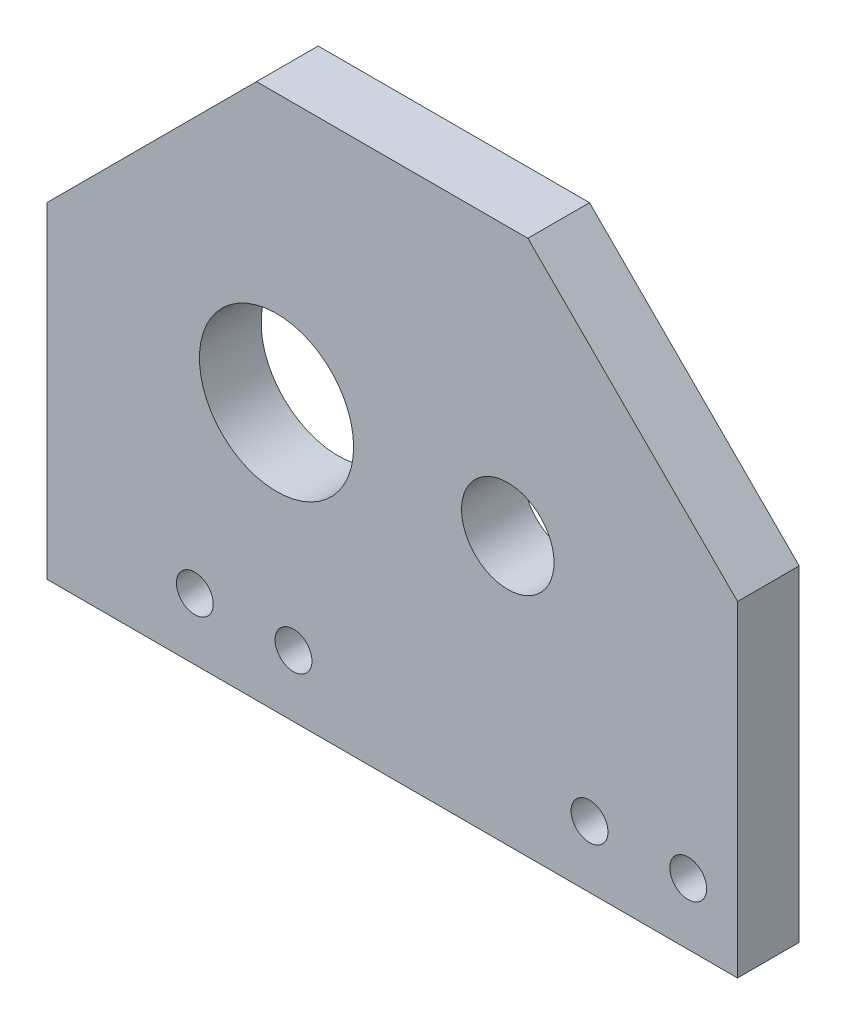
ISO-10303-21;
HEADER;
FILE_DESCRIPTION(('STEP AP214'),'2;1');
FILE_NAME('part.step','',(''),(''),'','','');
FILE_SCHEMA(('AUTOMOTIVE_DESIGN { 1 0 10303 214 1 1 1 1 }'));
ENDSEC;
DATA;
#1=APPLICATION_CONTEXT('core data for automotive mechanical design processes');
#2=APPLICATION_PROTOCOL_DEFINITION('international standard','automotive_design',2000,#1);
#3=PRODUCT_CONTEXT('',#1,'mechanical');
#4=PRODUCT('Part','Part','',(#3));
#5=PRODUCT_RELATED_PRODUCT_CATEGORY('part','',(#4));
#6=PRODUCT_DEFINITION_FORMATION('','',#4);
#7=PRODUCT_DEFINITION_CONTEXT('part definition',#1,'design');
#8=PRODUCT_DEFINITION('design','',#6,#7);
#9=PRODUCT_DEFINITION_SHAPE('','',#8);
#10=(LENGTH_UNIT() NAMED_UNIT(*) SI_UNIT(.MILLI.,.METRE.));
#11=(NAMED_UNIT(*) PLANE_ANGLE_UNIT() SI_UNIT($,.RADIAN.));
#12=(NAMED_UNIT(*) SI_UNIT($,.STERADIAN.) SOLID_ANGLE_UNIT());
#13=UNCERTAINTY_MEASURE_WITH_UNIT(LENGTH_MEASURE(1.E-05),#10,'distance_accuracy_value','');
#14=(GEOMETRIC_REPRESENTATION_CONTEXT(3) GLOBAL_UNCERTAINTY_ASSIGNED_CONTEXT((#13)) GLOBAL_UNIT_ASSIGNED_CONTEXT((#10,
#11,#12)) REPRESENTATION_CONTEXT('',''));
#15=CARTESIAN_POINT('',(0.,0.,0.));
#16=DIRECTION('',(0.,0.,1.));
#17=DIRECTION('',(1.,0.,0.));
#18=AXIS2_PLACEMENT_3D('',#15,#16,#17);
#19=CARTESIAN_POINT('',(0.,0.,6.35));
#20=DIRECTION('',(0.,0.,1.));
#21=DIRECTION('',(1.,0.,0.));
#22=AXIS2_PLACEMENT_3D('',#19,#20,#21);
#23=PLANE('',#22);
#24=DIRECTION('',(0.707106781186548,-0.707106781186548,0.));
#25=VECTOR('',#24,1.);
#26=CARTESIAN_POINT('',(35.56,5.99186000000002,6.35));
#27=LINE('',#26,#25);
#28=CARTESIAN_POINT('',(13.97,27.58186,6.35));
#29=VERTEX_POINT('',#28);
#30=CARTESIAN_POINT('',(35.56,5.99186000000002,6.35));
#31=VERTEX_POINT('',#30);
#32=EDGE_CURVE('E87',#29,#31,#27,.T.);
#33=ORIENTED_EDGE('',*,*,#32,.F.);
#34=DIRECTION('',(-1.,0.,0.));
#35=VECTOR('',#34,1.);
#36=CARTESIAN_POINT('',(35.56,27.58186,6.35));
#37=LINE('',#36,#35);
#38=CARTESIAN_POINT('',(-13.97,27.58186,6.35));
#39=VERTEX_POINT('',#38);
#40=EDGE_CURVE('E55',#29,#39,#37,.T.);
#41=ORIENTED_EDGE('',*,*,#40,.T.);
#42=DIRECTION('',(0.707106781186547,0.707106781186548,0.));
#43=VECTOR('',#42,1.);
#44=CARTESIAN_POINT('',(-13.97,27.58186,6.35));
#45=LINE('',#44,#43);
#46=CARTESIAN_POINT('',(-35.56,5.99186000000001,6.35));
#47=VERTEX_POINT('',#46);
#48=EDGE_CURVE('E145',#47,#39,#45,.T.);
#49=ORIENTED_EDGE('',*,*,#48,.F.);
#50=DIRECTION('',(0.,-1.,0.));
#51=VECTOR('',#50,1.);
#52=CARTESIAN_POINT('',(-35.56,-27.58186,6.35));
#53=LINE('',#52,#51);
#54=CARTESIAN_POINT('',(-35.56,-27.58186,6.35));
#55=VERTEX_POINT('',#54);
#56=EDGE_CURVE('E109',#47,#55,#53,.T.);
#57=ORIENTED_EDGE('',*,*,#56,.T.);
#58=DIRECTION('',(1.,0.,0.));
#59=VECTOR('',#58,1.);
#60=CARTESIAN_POINT('',(35.56,-27.58186,6.35));
#61=LINE('',#60,#59);
#62=CARTESIAN_POINT('',(35.56,-27.58186,6.35));
#63=VERTEX_POINT('',#62);
#64=EDGE_CURVE('E116',#55,#63,#61,.T.);
#65=ORIENTED_EDGE('',*,*,#64,.T.);
#66=DIRECTION('',(0.,1.,0.));
#67=VECTOR('',#66,1.);
#68=CARTESIAN_POINT('',(35.56,-27.58186,6.35));
#69=LINE('',#68,#67);
#70=EDGE_CURVE('E114',#63,#31,#69,.T.);
#71=ORIENTED_EDGE('',*,*,#70,.T.);
#72=EDGE_LOOP('',(#33,#41,#49,#57,#65,#71));
#73=FACE_BOUND('',#72,.T.);
#74=CARTESIAN_POINT('',(-20.32,-21.23186,6.35));
#75=DIRECTION('',(0.,0.,1.));
#76=DIRECTION('',(1.,0.,0.));
#77=AXIS2_PLACEMENT_3D('',#74,#75,#76);
#78=CIRCLE('',#77,1.89864999999999);
#79=CARTESIAN_POINT('',(-18.42135,-21.23186,6.35));
#80=VERTEX_POINT('',#79);
#81=EDGE_CURVE('E153',#80,#80,#78,.T.);
#82=ORIENTED_EDGE('',*,*,#81,.F.);
#83=EDGE_LOOP('',(#82));
#84=FACE_BOUND('',#83,.T.);
#85=CARTESIAN_POINT('',(-10.16,-21.23186,6.35));
#86=DIRECTION('',(0.,0.,1.));
#87=DIRECTION('',(1.,0.,0.));
#88=AXIS2_PLACEMENT_3D('',#85,#86,#87);
#89=CIRCLE('',#88,1.89864999999999);
#90=CARTESIAN_POINT('',(-8.26135000000002,-21.23186,6.35));
#91=VERTEX_POINT('',#90);
#92=EDGE_CURVE('E160',#91,#91,#89,.T.);
#93=ORIENTED_EDGE('',*,*,#92,.F.);
#94=EDGE_LOOP('',(#93));
#95=FACE_BOUND('',#94,.T.);
#96=CARTESIAN_POINT('',(20.32,-21.23186,6.35));
#97=DIRECTION('',(0.,0.,1.));
#98=DIRECTION('',(1.,0.,0.));
#99=AXIS2_PLACEMENT_3D('',#96,#97,#98);
#100=CIRCLE('',#99,1.89864999999999);
#101=CARTESIAN_POINT('',(22.21865,-21.23186,6.35));
#102=VERTEX_POINT('',#101);
#103=EDGE_CURVE('E166',#102,#102,#100,.T.);
#104=ORIENTED_EDGE('',*,*,#103,.F.);
#105=EDGE_LOOP('',(#104));
#106=FACE_BOUND('',#105,.T.);
#107=CARTESIAN_POINT('',(30.48,-21.23186,6.35));
#108=DIRECTION('',(0.,0.,1.));
#109=DIRECTION('',(1.,0.,0.));
#110=AXIS2_PLACEMENT_3D('',#107,#108,#109);
#111=CIRCLE('',#110,1.89864999999999);
#112=CARTESIAN_POINT('',(32.37865,-21.23186,6.35));
#113=VERTEX_POINT('',#112);
#114=EDGE_CURVE('E172',#113,#113,#111,.T.);
#115=ORIENTED_EDGE('',*,*,#114,.F.);
#116=EDGE_LOOP('',(#115));
#117=FACE_BOUND('',#116,.T.);
#118=CARTESIAN_POINT('',(11.90625,0.,6.35));
#119=DIRECTION('',(0.,0.,1.));
#120=DIRECTION('',(1.,0.,0.));
#121=AXIS2_PLACEMENT_3D('',#118,#119,#120);
#122=CIRCLE('',#121,4.7625);
#123=CARTESIAN_POINT('',(16.66875,0.,6.35));
#124=VERTEX_POINT('',#123);
#125=EDGE_CURVE('E119',#124,#124,#122,.T.);
#126=ORIENTED_EDGE('',*,*,#125,.F.);
#127=EDGE_LOOP('',(#126));
#128=FACE_BOUND('',#127,.T.);
#129=CARTESIAN_POINT('',(-11.90625,0.,6.35));
#130=DIRECTION('',(0.,0.,1.));
#131=DIRECTION('',(1.,0.,0.));
#132=AXIS2_PLACEMENT_3D('',#129,#130,#131);
#133=CIRCLE('',#132,7.9375);
#134=CARTESIAN_POINT('',(-3.96875,0.,6.35));
#135=VERTEX_POINT('',#134);
#136=EDGE_CURVE('E130',#135,#135,#133,.T.);
#137=ORIENTED_EDGE('',*,*,#136,.F.);
#138=EDGE_LOOP('',(#137));
#139=FACE_BOUND('',#138,.T.);
#140=ADVANCED_FACE('F32',(#73,#84,#95,#106,#117,#128,#139),#23,.T.);
#141=CARTESIAN_POINT('',(0.,0.,0.));
#142=DIRECTION('',(0.,0.,1.));
#143=DIRECTION('',(1.,0.,0.));
#144=AXIS2_PLACEMENT_3D('',#141,#142,#143);
#145=PLANE('',#144);
#146=CARTESIAN_POINT('',(-20.32,-21.23186,0.));
#147=DIRECTION('',(0.,0.,1.));
#148=DIRECTION('',(1.,0.,0.));
#149=AXIS2_PLACEMENT_3D('',#146,#147,#148);
#150=CIRCLE('',#149,1.89864999999999);
#151=CARTESIAN_POINT('',(-18.42135,-21.23186,0.));
#152=VERTEX_POINT('',#151);
#153=EDGE_CURVE('E157',#152,#152,#150,.T.);
#154=ORIENTED_EDGE('',*,*,#153,.T.);
#155=EDGE_LOOP('',(#154));
#156=FACE_BOUND('',#155,.T.);
#157=CARTESIAN_POINT('',(-10.16,-21.23186,0.));
#158=DIRECTION('',(0.,0.,1.));
#159=DIRECTION('',(1.,0.,0.));
#160=AXIS2_PLACEMENT_3D('',#157,#158,#159);
#161=CIRCLE('',#160,1.89864999999999);
#162=CARTESIAN_POINT('',(-8.26135000000002,-21.23186,0.));
#163=VERTEX_POINT('',#162);
#164=EDGE_CURVE('E163',#163,#163,#161,.T.);
#165=ORIENTED_EDGE('',*,*,#164,.T.);
#166=EDGE_LOOP('',(#165));
#167=FACE_BOUND('',#166,.T.);
#168=CARTESIAN_POINT('',(20.32,-21.23186,0.));
#169=DIRECTION('',(0.,0.,1.));
#170=DIRECTION('',(1.,0.,0.));
#171=AXIS2_PLACEMENT_3D('',#168,#169,#170);
#172=CIRCLE('',#171,1.89864999999999);
#173=CARTESIAN_POINT('',(22.21865,-21.23186,0.));
#174=VERTEX_POINT('',#173);
#175=EDGE_CURVE('E169',#174,#174,#172,.T.);
#176=ORIENTED_EDGE('',*,*,#175,.T.);
#177=EDGE_LOOP('',(#176));
#178=FACE_BOUND('',#177,.T.);
#179=CARTESIAN_POINT('',(30.48,-21.23186,0.));
#180=DIRECTION('',(0.,0.,1.));
#181=DIRECTION('',(1.,0.,0.));
#182=AXIS2_PLACEMENT_3D('',#179,#180,#181);
#183=CIRCLE('',#182,1.89864999999999);
#184=CARTESIAN_POINT('',(32.37865,-21.23186,0.));
#185=VERTEX_POINT('',#184);
#186=EDGE_CURVE('E175',#185,#185,#183,.T.);
#187=ORIENTED_EDGE('',*,*,#186,.T.);
#188=EDGE_LOOP('',(#187));
#189=FACE_BOUND('',#188,.T.);
#190=DIRECTION('',(-1.,0.,0.));
#191=VECTOR('',#190,1.);
#192=CARTESIAN_POINT('',(35.56,27.58186,0.));
#193=LINE('',#192,#191);
#194=CARTESIAN_POINT('',(13.97,27.58186,0.));
#195=VERTEX_POINT('',#194);
#196=CARTESIAN_POINT('',(-13.97,27.58186,0.));
#197=VERTEX_POINT('',#196);
#198=EDGE_CURVE('E102',#195,#197,#193,.T.);
#199=ORIENTED_EDGE('',*,*,#198,.F.);
#200=DIRECTION('',(0.707106781186548,-0.707106781186548,0.));
#201=VECTOR('',#200,1.);
#202=CARTESIAN_POINT('',(35.56,5.99186000000002,0.));
#203=LINE('',#202,#201);
#204=CARTESIAN_POINT('',(35.56,5.99186000000002,0.));
#205=VERTEX_POINT('',#204);
#206=EDGE_CURVE('E47',#195,#205,#203,.T.);
#207=ORIENTED_EDGE('',*,*,#206,.T.);
#208=DIRECTION('',(0.,1.,0.));
#209=VECTOR('',#208,1.);
#210=CARTESIAN_POINT('',(35.56,-27.58186,0.));
#211=LINE('',#210,#209);
#212=CARTESIAN_POINT('',(35.56,-27.58186,0.));
#213=VERTEX_POINT('',#212);
#214=EDGE_CURVE('E100',#213,#205,#211,.T.);
#215=ORIENTED_EDGE('',*,*,#214,.F.);
#216=DIRECTION('',(1.,0.,0.));
#217=VECTOR('',#216,1.);
#218=CARTESIAN_POINT('',(35.56,-27.58186,0.));
#219=LINE('',#218,#217);
#220=CARTESIAN_POINT('',(-35.56,-27.58186,0.));
#221=VERTEX_POINT('',#220);
#222=EDGE_CURVE('E107',#221,#213,#219,.T.);
#223=ORIENTED_EDGE('',*,*,#222,.F.);
#224=DIRECTION('',(0.,-1.,0.));
#225=VECTOR('',#224,1.);
#226=CARTESIAN_POINT('',(-35.56,-27.58186,0.));
#227=LINE('',#226,#225);
#228=CARTESIAN_POINT('',(-35.56,5.99186000000001,0.));
#229=VERTEX_POINT('',#228);
#230=EDGE_CURVE('E111',#229,#221,#227,.T.);
#231=ORIENTED_EDGE('',*,*,#230,.F.);
#232=DIRECTION('',(0.707106781186547,0.707106781186548,0.));
#233=VECTOR('',#232,1.);
#234=CARTESIAN_POINT('',(-13.97,27.58186,0.));
#235=LINE('',#234,#233);
#236=EDGE_CURVE('E141',#229,#197,#235,.T.);
#237=ORIENTED_EDGE('',*,*,#236,.T.);
#238=EDGE_LOOP('',(#199,#207,#215,#223,#231,#237));
#239=FACE_BOUND('',#238,.T.);
#240=CARTESIAN_POINT('',(11.90625,0.,0.));
#241=DIRECTION('',(0.,0.,1.));
#242=DIRECTION('',(1.,0.,0.));
#243=AXIS2_PLACEMENT_3D('',#240,#241,#242);
#244=CIRCLE('',#243,4.7625);
#245=CARTESIAN_POINT('',(16.66875,0.,0.));
#246=VERTEX_POINT('',#245);
#247=EDGE_CURVE('E125',#246,#246,#244,.T.);
#248=ORIENTED_EDGE('',*,*,#247,.T.);
#249=EDGE_LOOP('',(#248));
#250=FACE_BOUND('',#249,.T.);
#251=CARTESIAN_POINT('',(-11.90625,0.,0.));
#252=DIRECTION('',(0.,0.,1.));
#253=DIRECTION('',(1.,0.,0.));
#254=AXIS2_PLACEMENT_3D('',#251,#252,#253);
#255=CIRCLE('',#254,7.9375);
#256=CARTESIAN_POINT('',(-3.96875,0.,0.));
#257=VERTEX_POINT('',#256);
#258=EDGE_CURVE('E133',#257,#257,#255,.T.);
#259=ORIENTED_EDGE('',*,*,#258,.T.);
#260=EDGE_LOOP('',(#259));
#261=FACE_BOUND('',#260,.T.);
#262=ADVANCED_FACE('F97',(#156,#167,#178,#189,#239,#250,#261),#145,.F.);
#263=CARTESIAN_POINT('',(-35.56,-27.58186,6.35));
#264=DIRECTION('',(1.,0.,0.));
#265=DIRECTION('',(0.,0.,-1.));
#266=AXIS2_PLACEMENT_3D('',#263,#264,#265);
#267=PLANE('',#266);
#268=ORIENTED_EDGE('',*,*,#56,.F.);
#269=DIRECTION('',(0.,0.,1.));
#270=VECTOR('',#269,1.);
#271=CARTESIAN_POINT('',(-35.56,5.99186000000001,0.));
#272=LINE('',#271,#270);
#273=EDGE_CURVE('E148',#229,#47,#272,.T.);
#274=ORIENTED_EDGE('',*,*,#273,.F.);
#275=ORIENTED_EDGE('',*,*,#230,.T.);
#276=DIRECTION('',(0.,0.,-1.));
#277=VECTOR('',#276,1.);
#278=CARTESIAN_POINT('',(-35.56,-27.58186,6.35));
#279=LINE('',#278,#277);
#280=EDGE_CURVE('E11',#55,#221,#279,.T.);
#281=ORIENTED_EDGE('',*,*,#280,.F.);
#282=EDGE_LOOP('',(#268,#274,#275,#281));
#283=FACE_BOUND('',#282,.T.);
#284=ADVANCED_FACE('F34',(#283),#267,.F.);
#285=CARTESIAN_POINT('',(35.56,-27.58186,6.35));
#286=DIRECTION('',(0.,1.,0.));
#287=DIRECTION('',(-1.,0.,0.));
#288=AXIS2_PLACEMENT_3D('',#285,#286,#287);
#289=PLANE('',#288);
#290=ORIENTED_EDGE('',*,*,#222,.T.);
#291=DIRECTION('',(0.,0.,-1.));
#292=VECTOR('',#291,1.);
#293=CARTESIAN_POINT('',(35.56,-27.58186,6.35));
#294=LINE('',#293,#292);
#295=EDGE_CURVE('E40',#63,#213,#294,.T.);
#296=ORIENTED_EDGE('',*,*,#295,.F.);
#297=ORIENTED_EDGE('',*,*,#64,.F.);
#298=ORIENTED_EDGE('',*,*,#280,.T.);
#299=EDGE_LOOP('',(#290,#296,#297,#298));
#300=FACE_BOUND('',#299,.T.);
#301=ADVANCED_FACE('F140',(#300),#289,.F.);
#302=CARTESIAN_POINT('',(35.56,-27.58186,6.35));
#303=DIRECTION('',(-1.,0.,0.));
#304=DIRECTION('',(0.,0.,1.));
#305=AXIS2_PLACEMENT_3D('',#302,#303,#304);
#306=PLANE('',#305);
#307=ORIENTED_EDGE('',*,*,#214,.T.);
#308=DIRECTION('',(0.,0.,1.));
#309=VECTOR('',#308,1.);
#310=CARTESIAN_POINT('',(35.56,5.99186000000002,0.));
#311=LINE('',#310,#309);
#312=EDGE_CURVE('E85',#205,#31,#311,.T.);
#313=ORIENTED_EDGE('',*,*,#312,.T.);
#314=ORIENTED_EDGE('',*,*,#70,.F.);
#315=ORIENTED_EDGE('',*,*,#295,.T.);
#316=EDGE_LOOP('',(#307,#313,#314,#315));
#317=FACE_BOUND('',#316,.T.);
#318=ADVANCED_FACE('F105',(#317),#306,.F.);
#319=CARTESIAN_POINT('',(35.56,27.58186,6.35));
#320=DIRECTION('',(0.,-1.,0.));
#321=DIRECTION('',(1.,0.,0.));
#322=AXIS2_PLACEMENT_3D('',#319,#320,#321);
#323=PLANE('',#322);
#324=ORIENTED_EDGE('',*,*,#40,.F.);
#325=DIRECTION('',(0.,0.,1.));
#326=VECTOR('',#325,1.);
#327=CARTESIAN_POINT('',(13.97,27.58186,0.));
#328=LINE('',#327,#326);
#329=EDGE_CURVE('E92',#195,#29,#328,.T.);
#330=ORIENTED_EDGE('',*,*,#329,.F.);
#331=ORIENTED_EDGE('',*,*,#198,.T.);
#332=DIRECTION('',(0.,0.,1.));
#333=VECTOR('',#332,1.);
#334=CARTESIAN_POINT('',(-13.97,27.58186,0.));
#335=LINE('',#334,#333);
#336=EDGE_CURVE('E144',#197,#39,#335,.T.);
#337=ORIENTED_EDGE('',*,*,#336,.T.);
#338=EDGE_LOOP('',(#324,#330,#331,#337));
#339=FACE_BOUND('',#338,.T.);
#340=ADVANCED_FACE('F196',(#339),#323,.F.);
#341=CARTESIAN_POINT('',(11.90625,0.,6.35));
#342=DIRECTION('',(0.,0.,-1.));
#343=DIRECTION('',(-1.,0.,0.));
#344=AXIS2_PLACEMENT_3D('',#341,#342,#343);
#345=CYLINDRICAL_SURFACE('',#344,4.7625);
#346=ORIENTED_EDGE('',*,*,#125,.T.);
#347=EDGE_LOOP('',(#346));
#348=FACE_BOUND('',#347,.T.);
#349=ORIENTED_EDGE('',*,*,#247,.F.);
#350=EDGE_LOOP('',(#349));
#351=FACE_BOUND('',#350,.T.);
#352=ADVANCED_FACE('F187',(#348,#351),#345,.F.);
#353=CARTESIAN_POINT('',(-11.90625,0.,6.35));
#354=DIRECTION('',(0.,0.,-1.));
#355=DIRECTION('',(-1.,0.,0.));
#356=AXIS2_PLACEMENT_3D('',#353,#354,#355);
#357=CYLINDRICAL_SURFACE('',#356,7.9375);
#358=ORIENTED_EDGE('',*,*,#136,.T.);
#359=EDGE_LOOP('',(#358));
#360=FACE_BOUND('',#359,.T.);
#361=ORIENTED_EDGE('',*,*,#258,.F.);
#362=EDGE_LOOP('',(#361));
#363=FACE_BOUND('',#362,.T.);
#364=ADVANCED_FACE('F184',(#360,#363),#357,.F.);
#365=CARTESIAN_POINT('',(30.48,-21.23186,6.35));
#366=DIRECTION('',(0.,0.,1.));
#367=DIRECTION('',(1.,0.,0.));
#368=AXIS2_PLACEMENT_3D('',#365,#366,#367);
#369=CYLINDRICAL_SURFACE('',#368,1.89864999999999);
#370=ORIENTED_EDGE('',*,*,#186,.F.);
#371=EDGE_LOOP('',(#370));
#372=FACE_BOUND('',#371,.T.);
#373=ORIENTED_EDGE('',*,*,#114,.T.);
#374=EDGE_LOOP('',(#373));
#375=FACE_BOUND('',#374,.T.);
#376=ADVANCED_FACE('F186',(#372,#375),#369,.F.);
#377=CARTESIAN_POINT('',(20.32,-21.23186,6.35));
#378=DIRECTION('',(0.,0.,1.));
#379=DIRECTION('',(1.,0.,0.));
#380=AXIS2_PLACEMENT_3D('',#377,#378,#379);
#381=CYLINDRICAL_SURFACE('',#380,1.89864999999999);
#382=ORIENTED_EDGE('',*,*,#175,.F.);
#383=EDGE_LOOP('',(#382));
#384=FACE_BOUND('',#383,.T.);
#385=ORIENTED_EDGE('',*,*,#103,.T.);
#386=EDGE_LOOP('',(#385));
#387=FACE_BOUND('',#386,.T.);
#388=ADVANCED_FACE('F193',(#384,#387),#381,.F.);
#389=CARTESIAN_POINT('',(-10.16,-21.23186,6.35));
#390=DIRECTION('',(0.,0.,1.));
#391=DIRECTION('',(1.,0.,0.));
#392=AXIS2_PLACEMENT_3D('',#389,#390,#391);
#393=CYLINDRICAL_SURFACE('',#392,1.89864999999999);
#394=ORIENTED_EDGE('',*,*,#164,.F.);
#395=EDGE_LOOP('',(#394));
#396=FACE_BOUND('',#395,.T.);
#397=ORIENTED_EDGE('',*,*,#92,.T.);
#398=EDGE_LOOP('',(#397));
#399=FACE_BOUND('',#398,.T.);
#400=ADVANCED_FACE('F228',(#396,#399),#393,.F.);
#401=CARTESIAN_POINT('',(-20.32,-21.23186,6.35));
#402=DIRECTION('',(0.,0.,1.));
#403=DIRECTION('',(1.,0.,0.));
#404=AXIS2_PLACEMENT_3D('',#401,#402,#403);
#405=CYLINDRICAL_SURFACE('',#404,1.89864999999999);
#406=ORIENTED_EDGE('',*,*,#153,.F.);
#407=EDGE_LOOP('',(#406));
#408=FACE_BOUND('',#407,.T.);
#409=ORIENTED_EDGE('',*,*,#81,.T.);
#410=EDGE_LOOP('',(#409));
#411=FACE_BOUND('',#410,.T.);
#412=ADVANCED_FACE('F221',(#408,#411),#405,.F.);
#413=CARTESIAN_POINT('',(-13.97,27.58186,0.));
#414=DIRECTION('',(0.707106781186548,-0.707106781186547,0.));
#415=DIRECTION('',(0.707106781186547,0.707106781186548,0.));
#416=AXIS2_PLACEMENT_3D('',#413,#414,#415);
#417=PLANE('',#416);
#418=ORIENTED_EDGE('',*,*,#48,.T.);
#419=ORIENTED_EDGE('',*,*,#336,.F.);
#420=ORIENTED_EDGE('',*,*,#236,.F.);
#421=ORIENTED_EDGE('',*,*,#273,.T.);
#422=EDGE_LOOP('',(#418,#419,#420,#421));
#423=FACE_BOUND('',#422,.T.);
#424=ADVANCED_FACE('F218',(#423),#417,.F.);
#425=CARTESIAN_POINT('',(35.56,5.99186000000002,0.));
#426=DIRECTION('',(-0.707106781186547,-0.707106781186548,0.));
#427=DIRECTION('',(0.707106781186548,-0.707106781186547,0.));
#428=AXIS2_PLACEMENT_3D('',#425,#426,#427);
#429=PLANE('',#428);
#430=ORIENTED_EDGE('',*,*,#32,.T.);
#431=ORIENTED_EDGE('',*,*,#312,.F.);
#432=ORIENTED_EDGE('',*,*,#206,.F.);
#433=ORIENTED_EDGE('',*,*,#329,.T.);
#434=EDGE_LOOP('',(#430,#431,#432,#433));
#435=FACE_BOUND('',#434,.T.);
#436=ADVANCED_FACE('F86',(#435),#429,.F.);
#437=CLOSED_SHELL('',(#140,#262,#284,#301,#318,#340,#352,#364,#376,#388,#400,#412,#424,#436));
#438=MANIFOLD_SOLID_BREP('B2',#437);
#439=ADVANCED_BREP_SHAPE_REPRESENTATION('',(#18,#438),#14);
#440=SHAPE_DEFINITION_REPRESENTATION(#9,#439);
ENDSEC;
END-ISO-10303-21;
